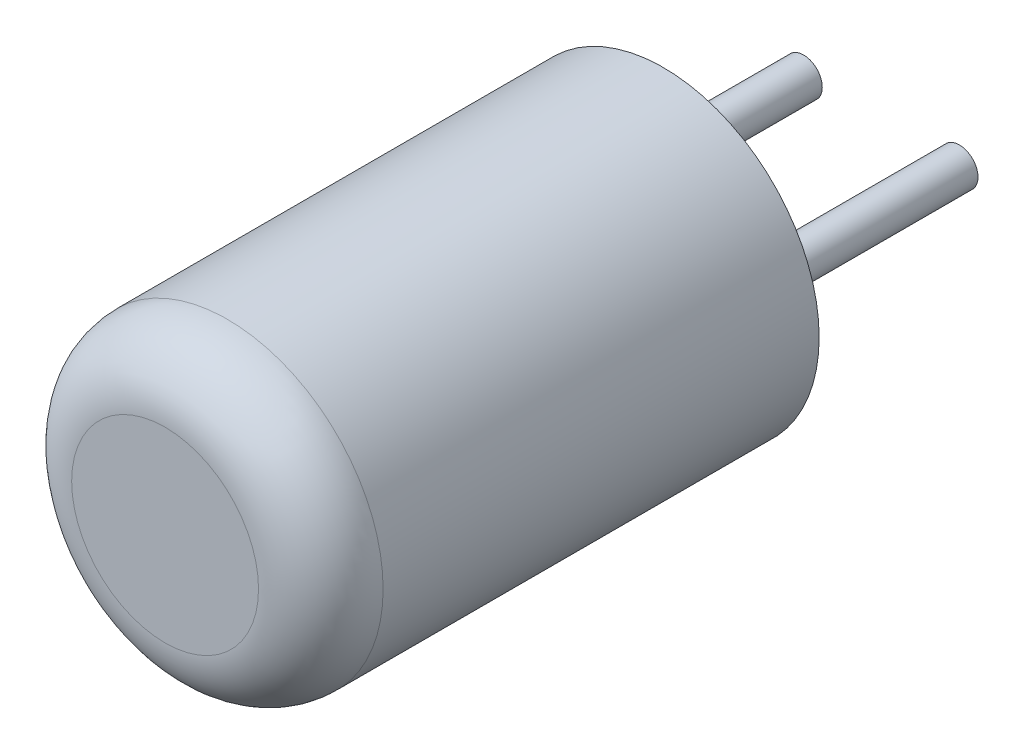
ISO-10303-21;
HEADER;
FILE_DESCRIPTION(('STEP AP214'),'2;1');
FILE_NAME('part.step','',(''),(''),'','','');
FILE_SCHEMA(('AUTOMOTIVE_DESIGN { 1 0 10303 214 1 1 1 1 }'));
ENDSEC;
DATA;
#1=APPLICATION_CONTEXT('core data for automotive mechanical design processes');
#2=APPLICATION_PROTOCOL_DEFINITION('international standard','automotive_design',2000,#1);
#3=PRODUCT_CONTEXT('',#1,'mechanical');
#4=PRODUCT('Part','Part','',(#3));
#5=PRODUCT_RELATED_PRODUCT_CATEGORY('part','',(#4));
#6=PRODUCT_DEFINITION_FORMATION('','',#4);
#7=PRODUCT_DEFINITION_CONTEXT('part definition',#1,'design');
#8=PRODUCT_DEFINITION('design','',#6,#7);
#9=PRODUCT_DEFINITION_SHAPE('','',#8);
#10=(LENGTH_UNIT() NAMED_UNIT(*) SI_UNIT(.MILLI.,.METRE.));
#11=(NAMED_UNIT(*) PLANE_ANGLE_UNIT() SI_UNIT($,.RADIAN.));
#12=(NAMED_UNIT(*) SI_UNIT($,.STERADIAN.) SOLID_ANGLE_UNIT());
#13=UNCERTAINTY_MEASURE_WITH_UNIT(LENGTH_MEASURE(1.E-05),#10,'distance_accuracy_value','');
#14=(GEOMETRIC_REPRESENTATION_CONTEXT(3) GLOBAL_UNCERTAINTY_ASSIGNED_CONTEXT((#13)) GLOBAL_UNIT_ASSIGNED_CONTEXT((#10,
#11,#12)) REPRESENTATION_CONTEXT('',''));
#15=CARTESIAN_POINT('',(0.,0.,0.));
#16=DIRECTION('',(0.,0.,1.));
#17=DIRECTION('',(1.,0.,0.));
#18=AXIS2_PLACEMENT_3D('',#15,#16,#17);
#19=CARTESIAN_POINT('',(0.,0.,0.));
#20=DIRECTION('',(0.,0.,1.));
#21=DIRECTION('',(1.,0.,0.));
#22=AXIS2_PLACEMENT_3D('',#19,#20,#21);
#23=PLANE('',#22);
#24=CARTESIAN_POINT('',(1.25,0.,0.));
#25=DIRECTION('',(0.,0.,1.));
#26=DIRECTION('',(1.,0.,0.));
#27=AXIS2_PLACEMENT_3D('',#24,#25,#26);
#28=CIRCLE('',#27,0.3);
#29=CARTESIAN_POINT('',(1.55,0.,0.));
#30=VERTEX_POINT('',#29);
#31=EDGE_CURVE('E43',#30,#30,#28,.F.);
#32=ORIENTED_EDGE('',*,*,#31,.F.);
#33=EDGE_LOOP('',(#32));
#34=FACE_BOUND('',#33,.T.);
#35=CARTESIAN_POINT('',(0.,0.,0.));
#36=DIRECTION('',(0.,0.,1.));
#37=DIRECTION('',(1.,0.,0.));
#38=AXIS2_PLACEMENT_3D('',#35,#36,#37);
#39=CIRCLE('',#38,2.5);
#40=CARTESIAN_POINT('',(2.5,0.,0.));
#41=VERTEX_POINT('',#40);
#42=EDGE_CURVE('E48',#41,#41,#39,.T.);
#43=ORIENTED_EDGE('',*,*,#42,.F.);
#44=EDGE_LOOP('',(#43));
#45=FACE_BOUND('',#44,.T.);
#46=CARTESIAN_POINT('',(-1.25,0.,0.));
#47=DIRECTION('',(0.,0.,1.));
#48=DIRECTION('',(1.,0.,0.));
#49=AXIS2_PLACEMENT_3D('',#46,#47,#48);
#50=CIRCLE('',#49,0.3);
#51=CARTESIAN_POINT('',(-0.95,0.,0.));
#52=VERTEX_POINT('',#51);
#53=EDGE_CURVE('E39',#52,#52,#50,.F.);
#54=ORIENTED_EDGE('',*,*,#53,.F.);
#55=EDGE_LOOP('',(#54));
#56=FACE_BOUND('',#55,.T.);
#57=ADVANCED_FACE('F28',(#34,#45,#56),#23,.F.);
#58=CARTESIAN_POINT('',(0.,0.,8.));
#59=DIRECTION('',(0.,0.,-1.));
#60=DIRECTION('',(-1.,0.,0.));
#61=AXIS2_PLACEMENT_3D('',#58,#59,#60);
#62=CYLINDRICAL_SURFACE('',#61,2.5);
#63=CARTESIAN_POINT('',(0.,0.,7.));
#64=DIRECTION('',(0.,0.,1.));
#65=DIRECTION('',(1.,0.,0.));
#66=AXIS2_PLACEMENT_3D('',#63,#64,#65);
#67=CIRCLE('',#66,2.5);
#68=CARTESIAN_POINT('',(2.5,0.,7.));
#69=VERTEX_POINT('',#68);
#70=EDGE_CURVE('E10',#69,#69,#67,.F.);
#71=ORIENTED_EDGE('',*,*,#70,.T.);
#72=EDGE_LOOP('',(#71));
#73=FACE_BOUND('',#72,.T.);
#74=ORIENTED_EDGE('',*,*,#42,.T.);
#75=EDGE_LOOP('',(#74));
#76=FACE_BOUND('',#75,.T.);
#77=ADVANCED_FACE('F68',(#73,#76),#62,.T.);
#78=CARTESIAN_POINT('',(0.,0.,8.));
#79=DIRECTION('',(0.,0.,1.));
#80=DIRECTION('',(1.,0.,0.));
#81=AXIS2_PLACEMENT_3D('',#78,#79,#80);
#82=PLANE('',#81);
#83=CARTESIAN_POINT('',(0.,0.,8.));
#84=DIRECTION('',(0.,0.,1.));
#85=DIRECTION('',(1.,0.,0.));
#86=AXIS2_PLACEMENT_3D('',#83,#84,#85);
#87=CIRCLE('',#86,1.5);
#88=CARTESIAN_POINT('',(1.5,0.,8.));
#89=VERTEX_POINT('',#88);
#90=EDGE_CURVE('E35',#89,#89,#87,.T.);
#91=ORIENTED_EDGE('',*,*,#90,.T.);
#92=EDGE_LOOP('',(#91));
#93=FACE_BOUND('',#92,.T.);
#94=ADVANCED_FACE('F74',(#93),#82,.T.);
#95=CARTESIAN_POINT('',(1.25,0.,-3.5));
#96=DIRECTION('',(0.,0.,1.));
#97=DIRECTION('',(1.,0.,0.));
#98=AXIS2_PLACEMENT_3D('',#95,#96,#97);
#99=CYLINDRICAL_SURFACE('',#98,0.3);
#100=CARTESIAN_POINT('',(1.25,0.,-3.5));
#101=DIRECTION('',(0.,0.,-1.));
#102=DIRECTION('',(-1.,0.,0.));
#103=AXIS2_PLACEMENT_3D('',#100,#101,#102);
#104=CIRCLE('',#103,0.3);
#105=CARTESIAN_POINT('',(0.95,0.,-3.5));
#106=VERTEX_POINT('',#105);
#107=EDGE_CURVE('E51',#106,#106,#104,.T.);
#108=ORIENTED_EDGE('',*,*,#107,.F.);
#109=EDGE_LOOP('',(#108));
#110=FACE_BOUND('',#109,.T.);
#111=ORIENTED_EDGE('',*,*,#31,.T.);
#112=EDGE_LOOP('',(#111));
#113=FACE_BOUND('',#112,.T.);
#114=ADVANCED_FACE('F80',(#110,#113),#99,.T.);
#115=CARTESIAN_POINT('',(1.25,0.,-3.5));
#116=DIRECTION('',(0.,0.,-1.));
#117=DIRECTION('',(-1.,0.,0.));
#118=AXIS2_PLACEMENT_3D('',#115,#116,#117);
#119=PLANE('',#118);
#120=ORIENTED_EDGE('',*,*,#107,.T.);
#121=EDGE_LOOP('',(#120));
#122=FACE_BOUND('',#121,.T.);
#123=ADVANCED_FACE('F63',(#122),#119,.T.);
#124=CARTESIAN_POINT('',(-1.25,0.,-3.5));
#125=DIRECTION('',(0.,0.,1.));
#126=DIRECTION('',(1.,0.,0.));
#127=AXIS2_PLACEMENT_3D('',#124,#125,#126);
#128=CYLINDRICAL_SURFACE('',#127,0.3);
#129=CARTESIAN_POINT('',(-1.25,0.,-3.5));
#130=DIRECTION('',(0.,0.,-1.));
#131=DIRECTION('',(-1.,0.,0.));
#132=AXIS2_PLACEMENT_3D('',#129,#130,#131);
#133=CIRCLE('',#132,0.3);
#134=CARTESIAN_POINT('',(-1.55,0.,-3.5));
#135=VERTEX_POINT('',#134);
#136=EDGE_CURVE('E54',#135,#135,#133,.T.);
#137=ORIENTED_EDGE('',*,*,#136,.F.);
#138=EDGE_LOOP('',(#137));
#139=FACE_BOUND('',#138,.T.);
#140=ORIENTED_EDGE('',*,*,#53,.T.);
#141=EDGE_LOOP('',(#140));
#142=FACE_BOUND('',#141,.T.);
#143=ADVANCED_FACE('F60',(#139,#142),#128,.T.);
#144=CARTESIAN_POINT('',(-1.25,0.,-3.5));
#145=DIRECTION('',(0.,0.,-1.));
#146=DIRECTION('',(-1.,0.,0.));
#147=AXIS2_PLACEMENT_3D('',#144,#145,#146);
#148=PLANE('',#147);
#149=ORIENTED_EDGE('',*,*,#136,.T.);
#150=EDGE_LOOP('',(#149));
#151=FACE_BOUND('',#150,.T.);
#152=ADVANCED_FACE('F58',(#151),#148,.T.);
#153=CARTESIAN_POINT('',(0.,0.,7.));
#154=DIRECTION('',(0.,0.,1.));
#155=DIRECTION('',(1.,0.,0.));
#156=AXIS2_PLACEMENT_3D('',#153,#154,#155);
#157=TOROIDAL_SURFACE('',#156,1.5,1.);
#158=ORIENTED_EDGE('',*,*,#70,.F.);
#159=EDGE_LOOP('',(#158));
#160=FACE_BOUND('',#159,.T.);
#161=ORIENTED_EDGE('',*,*,#90,.F.);
#162=EDGE_LOOP('',(#161));
#163=FACE_BOUND('',#162,.T.);
#164=ADVANCED_FACE('F30',(#160,#163),#157,.T.);
#165=CLOSED_SHELL('',(#57,#77,#94,#114,#123,#143,#152,#164));
#166=MANIFOLD_SOLID_BREP('B2',#165);
#167=ADVANCED_BREP_SHAPE_REPRESENTATION('',(#18,#166),#14);
#168=SHAPE_DEFINITION_REPRESENTATION(#9,#167);
ENDSEC;
END-ISO-10303-21;
